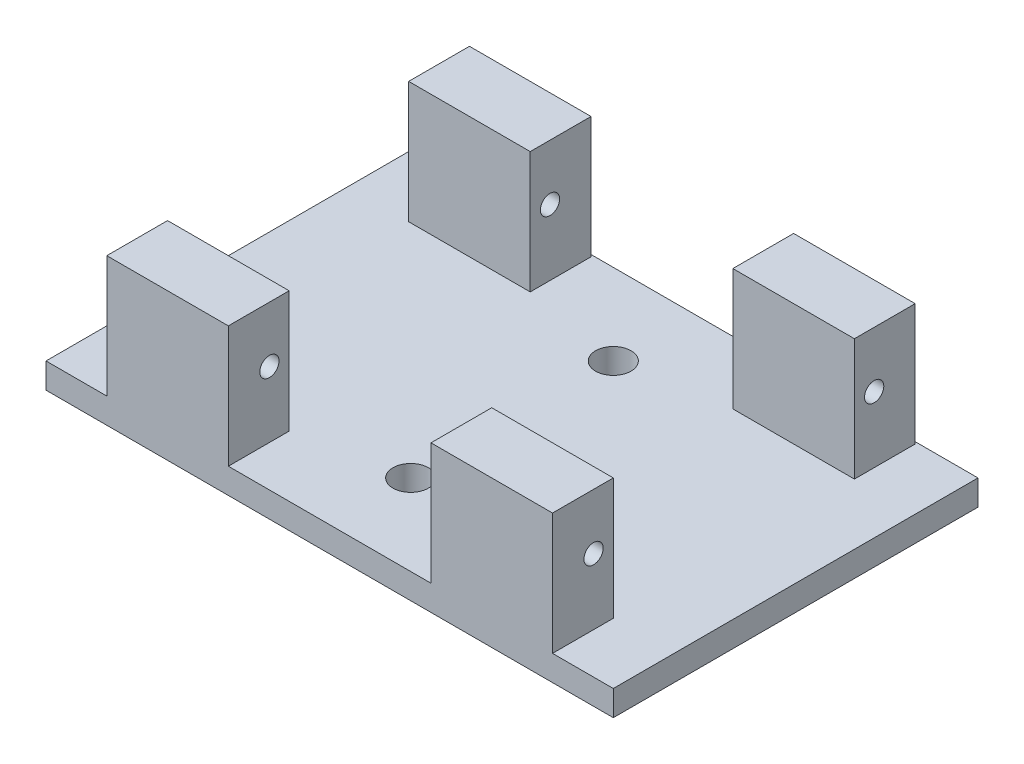
ISO-10303-21;
HEADER;
FILE_DESCRIPTION(('STEP AP214'),'2;1');
FILE_NAME('part.step','',(''),(''),'','','');
FILE_SCHEMA(('AUTOMOTIVE_DESIGN { 1 0 10303 214 1 1 1 1 }'));
ENDSEC;
DATA;
#1=APPLICATION_CONTEXT('core data for automotive mechanical design processes');
#2=APPLICATION_PROTOCOL_DEFINITION('international standard','automotive_design',2000,#1);
#3=PRODUCT_CONTEXT('',#1,'mechanical');
#4=PRODUCT('Part','Part','',(#3));
#5=PRODUCT_RELATED_PRODUCT_CATEGORY('part','',(#4));
#6=PRODUCT_DEFINITION_FORMATION('','',#4);
#7=PRODUCT_DEFINITION_CONTEXT('part definition',#1,'design');
#8=PRODUCT_DEFINITION('design','',#6,#7);
#9=PRODUCT_DEFINITION_SHAPE('','',#8);
#10=(LENGTH_UNIT() NAMED_UNIT(*) SI_UNIT(.MILLI.,.METRE.));
#11=(NAMED_UNIT(*) PLANE_ANGLE_UNIT() SI_UNIT($,.RADIAN.));
#12=(NAMED_UNIT(*) SI_UNIT($,.STERADIAN.) SOLID_ANGLE_UNIT());
#13=UNCERTAINTY_MEASURE_WITH_UNIT(LENGTH_MEASURE(1.E-05),#10,'distance_accuracy_value','');
#14=(GEOMETRIC_REPRESENTATION_CONTEXT(3) GLOBAL_UNCERTAINTY_ASSIGNED_CONTEXT((#13)) GLOBAL_UNIT_ASSIGNED_CONTEXT((#10,
#11,#12)) REPRESENTATION_CONTEXT('',''));
#15=CARTESIAN_POINT('',(0.,0.,0.));
#16=DIRECTION('',(0.,0.,1.));
#17=DIRECTION('',(1.,0.,0.));
#18=AXIS2_PLACEMENT_3D('',#15,#16,#17);
#19=CARTESIAN_POINT('',(0.,2.5,0.));
#20=DIRECTION('',(0.,1.,0.));
#21=DIRECTION('',(0.,0.,1.));
#22=AXIS2_PLACEMENT_3D('',#19,#20,#21);
#23=PLANE('',#22);
#24=CARTESIAN_POINT('',(0.,2.5,10.));
#25=DIRECTION('',(0.,1.,0.));
#26=DIRECTION('',(0.,0.,1.));
#27=AXIS2_PLACEMENT_3D('',#24,#25,#26);
#28=CIRCLE('',#27,1.75);
#29=CARTESIAN_POINT('',(0.,2.5,11.75));
#30=VERTEX_POINT('',#29);
#31=EDGE_CURVE('E691',#30,#30,#28,.T.);
#32=ORIENTED_EDGE('',*,*,#31,.F.);
#33=EDGE_LOOP('',(#32));
#34=FACE_BOUND('',#33,.T.);
#35=CARTESIAN_POINT('',(0.,2.5,-10.));
#36=DIRECTION('',(0.,1.,0.));
#37=DIRECTION('',(0.,0.,1.));
#38=AXIS2_PLACEMENT_3D('',#35,#36,#37);
#39=CIRCLE('',#38,1.75);
#40=CARTESIAN_POINT('',(0.,2.5,-8.25));
#41=VERTEX_POINT('',#40);
#42=EDGE_CURVE('E692',#41,#41,#39,.T.);
#43=ORIENTED_EDGE('',*,*,#42,.F.);
#44=EDGE_LOOP('',(#43));
#45=FACE_BOUND('',#44,.T.);
#46=DIRECTION('',(0.,0.,1.));
#47=VECTOR('',#46,1.);
#48=CARTESIAN_POINT('',(-10.,2.5,-17.8));
#49=LINE('',#48,#47);
#50=CARTESIAN_POINT('',(-10.,2.5,-17.8));
#51=VERTEX_POINT('',#50);
#52=CARTESIAN_POINT('',(-10.,2.5,-11.8));
#53=VERTEX_POINT('',#52);
#54=EDGE_CURVE('E183',#51,#53,#49,.T.);
#55=ORIENTED_EDGE('',*,*,#54,.T.);
#56=DIRECTION('',(-1.,0.,0.));
#57=VECTOR('',#56,1.);
#58=CARTESIAN_POINT('',(-10.,2.5,-11.8));
#59=LINE('',#58,#57);
#60=CARTESIAN_POINT('',(-22.,2.5,-11.8));
#61=VERTEX_POINT('',#60);
#62=EDGE_CURVE('E197',#53,#61,#59,.T.);
#63=ORIENTED_EDGE('',*,*,#62,.T.);
#64=DIRECTION('',(0.,0.,-1.));
#65=VECTOR('',#64,1.);
#66=CARTESIAN_POINT('',(-22.,2.5,-17.8));
#67=LINE('',#66,#65);
#68=CARTESIAN_POINT('',(-22.,2.5,-17.8));
#69=VERTEX_POINT('',#68);
#70=EDGE_CURVE('E61',#61,#69,#67,.T.);
#71=ORIENTED_EDGE('',*,*,#70,.T.);
#72=DIRECTION('',(1.,0.,0.));
#73=VECTOR('',#72,1.);
#74=CARTESIAN_POINT('',(-10.,2.5,-17.8));
#75=LINE('',#74,#73);
#76=EDGE_CURVE('E56',#69,#51,#75,.T.);
#77=ORIENTED_EDGE('',*,*,#76,.T.);
#78=EDGE_LOOP('',(#55,#63,#71,#77));
#79=FACE_BOUND('',#78,.T.);
#80=DIRECTION('',(0.,0.,1.));
#81=VECTOR('',#80,1.);
#82=CARTESIAN_POINT('',(-10.,2.5,12.));
#83=LINE('',#82,#81);
#84=CARTESIAN_POINT('',(-10.,2.5,12.));
#85=VERTEX_POINT('',#84);
#86=CARTESIAN_POINT('',(-10.,2.5,18.));
#87=VERTEX_POINT('',#86);
#88=EDGE_CURVE('E231',#85,#87,#83,.T.);
#89=ORIENTED_EDGE('',*,*,#88,.T.);
#90=DIRECTION('',(1.,0.,0.));
#91=VECTOR('',#90,1.);
#92=CARTESIAN_POINT('',(-28.,2.5,18.));
#93=LINE('',#92,#91);
#94=CARTESIAN_POINT('',(10.,2.5,18.));
#95=VERTEX_POINT('',#94);
#96=EDGE_CURVE('E331',#87,#95,#93,.T.);
#97=ORIENTED_EDGE('',*,*,#96,.T.);
#98=DIRECTION('',(0.,0.,1.));
#99=VECTOR('',#98,1.);
#100=CARTESIAN_POINT('',(10.,2.5,12.));
#101=LINE('',#100,#99);
#102=CARTESIAN_POINT('',(10.,2.5,12.));
#103=VERTEX_POINT('',#102);
#104=EDGE_CURVE('E275',#103,#95,#101,.T.);
#105=ORIENTED_EDGE('',*,*,#104,.F.);
#106=DIRECTION('',(-1.,0.,0.));
#107=VECTOR('',#106,1.);
#108=CARTESIAN_POINT('',(10.,2.5,12.));
#109=LINE('',#108,#107);
#110=CARTESIAN_POINT('',(22.,2.5,12.));
#111=VERTEX_POINT('',#110);
#112=EDGE_CURVE('E303',#111,#103,#109,.T.);
#113=ORIENTED_EDGE('',*,*,#112,.F.);
#114=DIRECTION('',(0.,0.,-1.));
#115=VECTOR('',#114,1.);
#116=CARTESIAN_POINT('',(22.,2.5,12.));
#117=LINE('',#116,#115);
#118=CARTESIAN_POINT('',(22.,2.5,18.));
#119=VERTEX_POINT('',#118);
#120=EDGE_CURVE('E306',#119,#111,#117,.T.);
#121=ORIENTED_EDGE('',*,*,#120,.F.);
#122=CARTESIAN_POINT('',(28.,2.5,18.));
#123=VERTEX_POINT('',#122);
#124=EDGE_CURVE('E327',#119,#123,#93,.T.);
#125=ORIENTED_EDGE('',*,*,#124,.T.);
#126=DIRECTION('',(0.,0.,-1.));
#127=VECTOR('',#126,1.);
#128=CARTESIAN_POINT('',(28.,2.5,-18.));
#129=LINE('',#128,#127);
#130=CARTESIAN_POINT('',(28.,2.5,-18.));
#131=VERTEX_POINT('',#130);
#132=EDGE_CURVE('E319',#123,#131,#129,.T.);
#133=ORIENTED_EDGE('',*,*,#132,.T.);
#134=DIRECTION('',(-1.,0.,0.));
#135=VECTOR('',#134,1.);
#136=CARTESIAN_POINT('',(-28.,2.5,-18.));
#137=LINE('',#136,#135);
#138=CARTESIAN_POINT('',(-28.,2.5,-18.));
#139=VERTEX_POINT('',#138);
#140=EDGE_CURVE('E322',#131,#139,#137,.T.);
#141=ORIENTED_EDGE('',*,*,#140,.T.);
#142=DIRECTION('',(0.,0.,1.));
#143=VECTOR('',#142,1.);
#144=CARTESIAN_POINT('',(-28.,2.5,-18.));
#145=LINE('',#144,#143);
#146=CARTESIAN_POINT('',(-28.,2.5,18.));
#147=VERTEX_POINT('',#146);
#148=EDGE_CURVE('E325',#139,#147,#145,.T.);
#149=ORIENTED_EDGE('',*,*,#148,.T.);
#150=CARTESIAN_POINT('',(-22.,2.5,18.));
#151=VERTEX_POINT('',#150);
#152=EDGE_CURVE('E328',#147,#151,#93,.T.);
#153=ORIENTED_EDGE('',*,*,#152,.T.);
#154=DIRECTION('',(0.,0.,-1.));
#155=VECTOR('',#154,1.);
#156=CARTESIAN_POINT('',(-22.,2.5,12.));
#157=LINE('',#156,#155);
#158=CARTESIAN_POINT('',(-22.,2.5,12.));
#159=VERTEX_POINT('',#158);
#160=EDGE_CURVE('E221',#151,#159,#157,.T.);
#161=ORIENTED_EDGE('',*,*,#160,.T.);
#162=DIRECTION('',(1.,0.,0.));
#163=VECTOR('',#162,1.);
#164=CARTESIAN_POINT('',(-10.,2.5,12.));
#165=LINE('',#164,#163);
#166=EDGE_CURVE('E234',#159,#85,#165,.T.);
#167=ORIENTED_EDGE('',*,*,#166,.T.);
#168=EDGE_LOOP('',(#89,#97,#105,#113,#121,#125,#133,#141,#149,#153,#161,#167));
#169=FACE_BOUND('',#168,.T.);
#170=DIRECTION('',(1.,0.,0.));
#171=VECTOR('',#170,1.);
#172=CARTESIAN_POINT('',(10.,2.5,-11.8));
#173=LINE('',#172,#171);
#174=CARTESIAN_POINT('',(10.,2.5,-11.8));
#175=VERTEX_POINT('',#174);
#176=CARTESIAN_POINT('',(22.,2.5,-11.8));
#177=VERTEX_POINT('',#176);
#178=EDGE_CURVE('E274',#175,#177,#173,.T.);
#179=ORIENTED_EDGE('',*,*,#178,.F.);
#180=DIRECTION('',(0.,0.,1.));
#181=VECTOR('',#180,1.);
#182=CARTESIAN_POINT('',(10.,2.5,-17.8));
#183=LINE('',#182,#181);
#184=CARTESIAN_POINT('',(10.,2.5,-17.8));
#185=VERTEX_POINT('',#184);
#186=EDGE_CURVE('E271',#185,#175,#183,.T.);
#187=ORIENTED_EDGE('',*,*,#186,.F.);
#188=DIRECTION('',(-1.,0.,0.));
#189=VECTOR('',#188,1.);
#190=CARTESIAN_POINT('',(10.,2.5,-17.8));
#191=LINE('',#190,#189);
#192=CARTESIAN_POINT('',(22.,2.5,-17.8));
#193=VERTEX_POINT('',#192);
#194=EDGE_CURVE('E264',#193,#185,#191,.T.);
#195=ORIENTED_EDGE('',*,*,#194,.F.);
#196=DIRECTION('',(0.,0.,-1.));
#197=VECTOR('',#196,1.);
#198=CARTESIAN_POINT('',(22.,2.5,-17.8));
#199=LINE('',#198,#197);
#200=EDGE_CURVE('E277',#177,#193,#199,.T.);
#201=ORIENTED_EDGE('',*,*,#200,.F.);
#202=EDGE_LOOP('',(#179,#187,#195,#201));
#203=FACE_BOUND('',#202,.T.);
#204=ADVANCED_FACE('F41',(#34,#45,#79,#169,#203),#23,.T.);
#205=CARTESIAN_POINT('',(28.,2.5,-18.));
#206=DIRECTION('',(-1.,0.,0.));
#207=DIRECTION('',(0.,0.,1.));
#208=AXIS2_PLACEMENT_3D('',#205,#206,#207);
#209=PLANE('',#208);
#210=DIRECTION('',(0.,0.,-1.));
#211=VECTOR('',#210,1.);
#212=CARTESIAN_POINT('',(28.,0.,-18.));
#213=LINE('',#212,#211);
#214=CARTESIAN_POINT('',(28.,0.,18.));
#215=VERTEX_POINT('',#214);
#216=CARTESIAN_POINT('',(28.,0.,-18.));
#217=VERTEX_POINT('',#216);
#218=EDGE_CURVE('E290',#215,#217,#213,.T.);
#219=ORIENTED_EDGE('',*,*,#218,.T.);
#220=DIRECTION('',(0.,-1.,0.));
#221=VECTOR('',#220,1.);
#222=CARTESIAN_POINT('',(28.,2.5,-18.));
#223=LINE('',#222,#221);
#224=EDGE_CURVE('E11',#131,#217,#223,.T.);
#225=ORIENTED_EDGE('',*,*,#224,.F.);
#226=ORIENTED_EDGE('',*,*,#132,.F.);
#227=DIRECTION('',(0.,-1.,0.));
#228=VECTOR('',#227,1.);
#229=CARTESIAN_POINT('',(28.,2.5,18.));
#230=LINE('',#229,#228);
#231=EDGE_CURVE('E330',#123,#215,#230,.T.);
#232=ORIENTED_EDGE('',*,*,#231,.T.);
#233=EDGE_LOOP('',(#219,#225,#226,#232));
#234=FACE_BOUND('',#233,.T.);
#235=ADVANCED_FACE('F43',(#234),#209,.F.);
#236=CARTESIAN_POINT('',(-28.,2.5,-18.));
#237=DIRECTION('',(0.,0.,1.));
#238=DIRECTION('',(1.,0.,0.));
#239=AXIS2_PLACEMENT_3D('',#236,#237,#238);
#240=PLANE('',#239);
#241=DIRECTION('',(-1.,0.,0.));
#242=VECTOR('',#241,1.);
#243=CARTESIAN_POINT('',(-28.,0.,-18.));
#244=LINE('',#243,#242);
#245=CARTESIAN_POINT('',(-28.,0.,-18.));
#246=VERTEX_POINT('',#245);
#247=EDGE_CURVE('E334',#217,#246,#244,.T.);
#248=ORIENTED_EDGE('',*,*,#247,.T.);
#249=DIRECTION('',(0.,-1.,0.));
#250=VECTOR('',#249,1.);
#251=CARTESIAN_POINT('',(-28.,2.5,-18.));
#252=LINE('',#251,#250);
#253=EDGE_CURVE('E49',#139,#246,#252,.T.);
#254=ORIENTED_EDGE('',*,*,#253,.F.);
#255=ORIENTED_EDGE('',*,*,#140,.F.);
#256=ORIENTED_EDGE('',*,*,#224,.T.);
#257=EDGE_LOOP('',(#248,#254,#255,#256));
#258=FACE_BOUND('',#257,.T.);
#259=ADVANCED_FACE('F401',(#258),#240,.F.);
#260=CARTESIAN_POINT('',(-28.,2.5,-18.));
#261=DIRECTION('',(1.,0.,0.));
#262=DIRECTION('',(0.,0.,-1.));
#263=AXIS2_PLACEMENT_3D('',#260,#261,#262);
#264=PLANE('',#263);
#265=DIRECTION('',(0.,0.,1.));
#266=VECTOR('',#265,1.);
#267=CARTESIAN_POINT('',(-28.,0.,-18.));
#268=LINE('',#267,#266);
#269=CARTESIAN_POINT('',(-28.,0.,18.));
#270=VERTEX_POINT('',#269);
#271=EDGE_CURVE('E336',#246,#270,#268,.T.);
#272=ORIENTED_EDGE('',*,*,#271,.T.);
#273=DIRECTION('',(0.,-1.,0.));
#274=VECTOR('',#273,1.);
#275=CARTESIAN_POINT('',(-28.,2.5,18.));
#276=LINE('',#275,#274);
#277=EDGE_CURVE('E341',#147,#270,#276,.T.);
#278=ORIENTED_EDGE('',*,*,#277,.F.);
#279=ORIENTED_EDGE('',*,*,#148,.F.);
#280=ORIENTED_EDGE('',*,*,#253,.T.);
#281=EDGE_LOOP('',(#272,#278,#279,#280));
#282=FACE_BOUND('',#281,.T.);
#283=ADVANCED_FACE('F348',(#282),#264,.F.);
#284=CARTESIAN_POINT('',(-28.,2.5,18.));
#285=DIRECTION('',(0.,0.,-1.));
#286=DIRECTION('',(-1.,0.,0.));
#287=AXIS2_PLACEMENT_3D('',#284,#285,#286);
#288=PLANE('',#287);
#289=DIRECTION('',(1.,0.,0.));
#290=VECTOR('',#289,1.);
#291=CARTESIAN_POINT('',(-28.,0.,18.));
#292=LINE('',#291,#290);
#293=EDGE_CURVE('E323',#270,#215,#292,.T.);
#294=ORIENTED_EDGE('',*,*,#293,.T.);
#295=ORIENTED_EDGE('',*,*,#231,.F.);
#296=ORIENTED_EDGE('',*,*,#124,.F.);
#297=DIRECTION('',(0.,-1.,0.));
#298=VECTOR('',#297,1.);
#299=CARTESIAN_POINT('',(22.,14.5,18.));
#300=LINE('',#299,#298);
#301=CARTESIAN_POINT('',(22.,14.5,18.));
#302=VERTEX_POINT('',#301);
#303=EDGE_CURVE('E293',#302,#119,#300,.T.);
#304=ORIENTED_EDGE('',*,*,#303,.F.);
#305=DIRECTION('',(1.,0.,0.));
#306=VECTOR('',#305,1.);
#307=CARTESIAN_POINT('',(10.,14.5,18.));
#308=LINE('',#307,#306);
#309=CARTESIAN_POINT('',(10.,14.5,18.));
#310=VERTEX_POINT('',#309);
#311=EDGE_CURVE('E315',#310,#302,#308,.T.);
#312=ORIENTED_EDGE('',*,*,#311,.F.);
#313=DIRECTION('',(0.,-1.,0.));
#314=VECTOR('',#313,1.);
#315=CARTESIAN_POINT('',(10.,14.5,18.));
#316=LINE('',#315,#314);
#317=EDGE_CURVE('E259',#310,#95,#316,.T.);
#318=ORIENTED_EDGE('',*,*,#317,.T.);
#319=ORIENTED_EDGE('',*,*,#96,.F.);
#320=DIRECTION('',(0.,-1.,0.));
#321=VECTOR('',#320,1.);
#322=CARTESIAN_POINT('',(-10.,14.5,18.));
#323=LINE('',#322,#321);
#324=CARTESIAN_POINT('',(-10.,14.5,18.));
#325=VERTEX_POINT('',#324);
#326=EDGE_CURVE('E230',#325,#87,#323,.T.);
#327=ORIENTED_EDGE('',*,*,#326,.F.);
#328=DIRECTION('',(-1.,0.,0.));
#329=VECTOR('',#328,1.);
#330=CARTESIAN_POINT('',(-10.,14.5,18.));
#331=LINE('',#330,#329);
#332=CARTESIAN_POINT('',(-22.,14.5,18.));
#333=VERTEX_POINT('',#332);
#334=EDGE_CURVE('E227',#325,#333,#331,.T.);
#335=ORIENTED_EDGE('',*,*,#334,.T.);
#336=DIRECTION('',(0.,-1.,0.));
#337=VECTOR('',#336,1.);
#338=CARTESIAN_POINT('',(-22.,14.5,18.));
#339=LINE('',#338,#337);
#340=EDGE_CURVE('E240',#333,#151,#339,.T.);
#341=ORIENTED_EDGE('',*,*,#340,.T.);
#342=ORIENTED_EDGE('',*,*,#152,.F.);
#343=ORIENTED_EDGE('',*,*,#277,.T.);
#344=EDGE_LOOP('',(#294,#295,#296,#304,#312,#318,#319,#327,#335,#341,#342,#343));
#345=FACE_BOUND('',#344,.T.);
#346=ADVANCED_FACE('F357',(#345),#288,.F.);
#347=CARTESIAN_POINT('',(0.,0.,0.));
#348=DIRECTION('',(0.,1.,0.));
#349=DIRECTION('',(0.,0.,1.));
#350=AXIS2_PLACEMENT_3D('',#347,#348,#349);
#351=PLANE('',#350);
#352=CARTESIAN_POINT('',(0.,0.,10.));
#353=DIRECTION('',(0.,1.,0.));
#354=DIRECTION('',(0.,0.,1.));
#355=AXIS2_PLACEMENT_3D('',#352,#353,#354);
#356=CIRCLE('',#355,1.75);
#357=CARTESIAN_POINT('',(0.,0.,11.75));
#358=VERTEX_POINT('',#357);
#359=EDGE_CURVE('E689',#358,#358,#356,.T.);
#360=ORIENTED_EDGE('',*,*,#359,.T.);
#361=EDGE_LOOP('',(#360));
#362=FACE_BOUND('',#361,.T.);
#363=CARTESIAN_POINT('',(0.,0.,-10.));
#364=DIRECTION('',(0.,1.,0.));
#365=DIRECTION('',(0.,0.,1.));
#366=AXIS2_PLACEMENT_3D('',#363,#364,#365);
#367=CIRCLE('',#366,1.75);
#368=CARTESIAN_POINT('',(0.,0.,-8.25));
#369=VERTEX_POINT('',#368);
#370=EDGE_CURVE('E697',#369,#369,#367,.T.);
#371=ORIENTED_EDGE('',*,*,#370,.T.);
#372=EDGE_LOOP('',(#371));
#373=FACE_BOUND('',#372,.T.);
#374=ORIENTED_EDGE('',*,*,#218,.F.);
#375=ORIENTED_EDGE('',*,*,#293,.F.);
#376=ORIENTED_EDGE('',*,*,#271,.F.);
#377=ORIENTED_EDGE('',*,*,#247,.F.);
#378=EDGE_LOOP('',(#374,#375,#376,#377));
#379=FACE_BOUND('',#378,.T.);
#380=ADVANCED_FACE('F354',(#362,#373,#379),#351,.F.);
#381=CARTESIAN_POINT('',(10.,14.5,-17.8));
#382=DIRECTION('',(1.,0.,0.));
#383=DIRECTION('',(0.,0.,-1.));
#384=AXIS2_PLACEMENT_3D('',#381,#382,#383);
#385=PLANE('',#384);
#386=CARTESIAN_POINT('',(10.,9.,-13.75));
#387=DIRECTION('',(1.,0.,0.));
#388=DIRECTION('',(0.,0.,-1.));
#389=AXIS2_PLACEMENT_3D('',#386,#387,#388);
#390=CIRCLE('',#389,0.949999999999999);
#391=CARTESIAN_POINT('',(10.,9.,-14.7));
#392=VERTEX_POINT('',#391);
#393=EDGE_CURVE('E256',#392,#392,#390,.T.);
#394=ORIENTED_EDGE('',*,*,#393,.T.);
#395=EDGE_LOOP('',(#394));
#396=FACE_BOUND('',#395,.T.);
#397=ORIENTED_EDGE('',*,*,#186,.T.);
#398=DIRECTION('',(0.,-1.,0.));
#399=VECTOR('',#398,1.);
#400=CARTESIAN_POINT('',(10.,14.5,-11.8));
#401=LINE('',#400,#399);
#402=CARTESIAN_POINT('',(10.,14.5,-11.8));
#403=VERTEX_POINT('',#402);
#404=EDGE_CURVE('E288',#403,#175,#401,.T.);
#405=ORIENTED_EDGE('',*,*,#404,.F.);
#406=DIRECTION('',(0.,0.,1.));
#407=VECTOR('',#406,1.);
#408=CARTESIAN_POINT('',(10.,14.5,-17.8));
#409=LINE('',#408,#407);
#410=CARTESIAN_POINT('',(10.,14.5,-17.8));
#411=VERTEX_POINT('',#410);
#412=EDGE_CURVE('E260',#411,#403,#409,.T.);
#413=ORIENTED_EDGE('',*,*,#412,.F.);
#414=DIRECTION('',(0.,-1.,0.));
#415=VECTOR('',#414,1.);
#416=CARTESIAN_POINT('',(10.,14.5,-17.8));
#417=LINE('',#416,#415);
#418=EDGE_CURVE('E270',#411,#185,#417,.T.);
#419=ORIENTED_EDGE('',*,*,#418,.T.);
#420=EDGE_LOOP('',(#397,#405,#413,#419));
#421=FACE_BOUND('',#420,.T.);
#422=ADVANCED_FACE('F406',(#396,#421),#385,.F.);
#423=CARTESIAN_POINT('',(10.,14.5,-11.8));
#424=DIRECTION('',(0.,0.,-1.));
#425=DIRECTION('',(-1.,0.,0.));
#426=AXIS2_PLACEMENT_3D('',#423,#424,#425);
#427=PLANE('',#426);
#428=ORIENTED_EDGE('',*,*,#178,.T.);
#429=DIRECTION('',(0.,-1.,0.));
#430=VECTOR('',#429,1.);
#431=CARTESIAN_POINT('',(22.,14.5,-11.8));
#432=LINE('',#431,#430);
#433=CARTESIAN_POINT('',(22.,14.5,-11.8));
#434=VERTEX_POINT('',#433);
#435=EDGE_CURVE('E285',#434,#177,#432,.T.);
#436=ORIENTED_EDGE('',*,*,#435,.F.);
#437=DIRECTION('',(1.,0.,0.));
#438=VECTOR('',#437,1.);
#439=CARTESIAN_POINT('',(10.,14.5,-11.8));
#440=LINE('',#439,#438);
#441=EDGE_CURVE('E263',#403,#434,#440,.T.);
#442=ORIENTED_EDGE('',*,*,#441,.F.);
#443=ORIENTED_EDGE('',*,*,#404,.T.);
#444=EDGE_LOOP('',(#428,#436,#442,#443));
#445=FACE_BOUND('',#444,.T.);
#446=ADVANCED_FACE('F426',(#445),#427,.F.);
#447=CARTESIAN_POINT('',(22.,14.5,-17.8));
#448=DIRECTION('',(-1.,0.,0.));
#449=DIRECTION('',(0.,0.,1.));
#450=AXIS2_PLACEMENT_3D('',#447,#448,#449);
#451=PLANE('',#450);
#452=CARTESIAN_POINT('',(22.,9.,-13.75));
#453=DIRECTION('',(1.,0.,0.));
#454=DIRECTION('',(0.,0.,-1.));
#455=AXIS2_PLACEMENT_3D('',#452,#453,#454);
#456=CIRCLE('',#455,0.949999999999999);
#457=CARTESIAN_POINT('',(22.,9.,-14.7));
#458=VERTEX_POINT('',#457);
#459=EDGE_CURVE('E186',#458,#458,#456,.T.);
#460=ORIENTED_EDGE('',*,*,#459,.F.);
#461=EDGE_LOOP('',(#460));
#462=FACE_BOUND('',#461,.T.);
#463=ORIENTED_EDGE('',*,*,#200,.T.);
#464=DIRECTION('',(0.,-1.,0.));
#465=VECTOR('',#464,1.);
#466=CARTESIAN_POINT('',(22.,14.5,-17.8));
#467=LINE('',#466,#465);
#468=CARTESIAN_POINT('',(22.,14.5,-17.8));
#469=VERTEX_POINT('',#468);
#470=EDGE_CURVE('E283',#469,#193,#467,.T.);
#471=ORIENTED_EDGE('',*,*,#470,.F.);
#472=DIRECTION('',(0.,0.,-1.));
#473=VECTOR('',#472,1.);
#474=CARTESIAN_POINT('',(22.,14.5,-17.8));
#475=LINE('',#474,#473);
#476=EDGE_CURVE('E266',#434,#469,#475,.T.);
#477=ORIENTED_EDGE('',*,*,#476,.F.);
#478=ORIENTED_EDGE('',*,*,#435,.T.);
#479=EDGE_LOOP('',(#463,#471,#477,#478));
#480=FACE_BOUND('',#479,.T.);
#481=ADVANCED_FACE('F430',(#462,#480),#451,.F.);
#482=CARTESIAN_POINT('',(10.,14.5,-17.8));
#483=DIRECTION('',(0.,0.,1.));
#484=DIRECTION('',(1.,0.,0.));
#485=AXIS2_PLACEMENT_3D('',#482,#483,#484);
#486=PLANE('',#485);
#487=ORIENTED_EDGE('',*,*,#194,.T.);
#488=ORIENTED_EDGE('',*,*,#418,.F.);
#489=DIRECTION('',(-1.,0.,0.));
#490=VECTOR('',#489,1.);
#491=CARTESIAN_POINT('',(10.,14.5,-17.8));
#492=LINE('',#491,#490);
#493=EDGE_CURVE('E268',#469,#411,#492,.T.);
#494=ORIENTED_EDGE('',*,*,#493,.F.);
#495=ORIENTED_EDGE('',*,*,#470,.T.);
#496=EDGE_LOOP('',(#487,#488,#494,#495));
#497=FACE_BOUND('',#496,.T.);
#498=ADVANCED_FACE('F438',(#497),#486,.F.);
#499=CARTESIAN_POINT('',(0.,14.5,0.));
#500=DIRECTION('',(0.,1.,0.));
#501=DIRECTION('',(0.,0.,1.));
#502=AXIS2_PLACEMENT_3D('',#499,#500,#501);
#503=PLANE('',#502);
#504=ORIENTED_EDGE('',*,*,#412,.T.);
#505=ORIENTED_EDGE('',*,*,#441,.T.);
#506=ORIENTED_EDGE('',*,*,#476,.T.);
#507=ORIENTED_EDGE('',*,*,#493,.T.);
#508=EDGE_LOOP('',(#504,#505,#506,#507));
#509=FACE_BOUND('',#508,.T.);
#510=ADVANCED_FACE('F442',(#509),#503,.T.);
#511=CARTESIAN_POINT('',(10.,14.5,12.));
#512=DIRECTION('',(1.,0.,0.));
#513=DIRECTION('',(0.,0.,-1.));
#514=AXIS2_PLACEMENT_3D('',#511,#512,#513);
#515=PLANE('',#514);
#516=CARTESIAN_POINT('',(10.,9.,13.95));
#517=DIRECTION('',(1.,0.,0.));
#518=DIRECTION('',(0.,0.,-1.));
#519=AXIS2_PLACEMENT_3D('',#516,#517,#518);
#520=CIRCLE('',#519,0.949999999999999);
#521=CARTESIAN_POINT('',(10.,9.,13.));
#522=VERTEX_POINT('',#521);
#523=EDGE_CURVE('E251',#522,#522,#520,.T.);
#524=ORIENTED_EDGE('',*,*,#523,.T.);
#525=EDGE_LOOP('',(#524));
#526=FACE_BOUND('',#525,.T.);
#527=ORIENTED_EDGE('',*,*,#104,.T.);
#528=ORIENTED_EDGE('',*,*,#317,.F.);
#529=DIRECTION('',(0.,0.,1.));
#530=VECTOR('',#529,1.);
#531=CARTESIAN_POINT('',(10.,14.5,12.));
#532=LINE('',#531,#530);
#533=CARTESIAN_POINT('',(10.,14.5,12.));
#534=VERTEX_POINT('',#533);
#535=EDGE_CURVE('E307',#534,#310,#532,.T.);
#536=ORIENTED_EDGE('',*,*,#535,.F.);
#537=DIRECTION('',(0.,-1.,0.));
#538=VECTOR('',#537,1.);
#539=CARTESIAN_POINT('',(10.,14.5,12.));
#540=LINE('',#539,#538);
#541=EDGE_CURVE('E299',#534,#103,#540,.T.);
#542=ORIENTED_EDGE('',*,*,#541,.T.);
#543=EDGE_LOOP('',(#527,#528,#536,#542));
#544=FACE_BOUND('',#543,.T.);
#545=ADVANCED_FACE('F370',(#526,#544),#515,.F.);
#546=CARTESIAN_POINT('',(22.,14.5,12.));
#547=DIRECTION('',(-1.,0.,0.));
#548=DIRECTION('',(0.,0.,1.));
#549=AXIS2_PLACEMENT_3D('',#546,#547,#548);
#550=PLANE('',#549);
#551=CARTESIAN_POINT('',(22.,9.,13.95));
#552=DIRECTION('',(1.,0.,0.));
#553=DIRECTION('',(0.,0.,-1.));
#554=AXIS2_PLACEMENT_3D('',#551,#552,#553);
#555=CIRCLE('',#554,0.949999999999999);
#556=CARTESIAN_POINT('',(22.,9.,13.));
#557=VERTEX_POINT('',#556);
#558=EDGE_CURVE('E248',#557,#557,#555,.T.);
#559=ORIENTED_EDGE('',*,*,#558,.F.);
#560=EDGE_LOOP('',(#559));
#561=FACE_BOUND('',#560,.T.);
#562=ORIENTED_EDGE('',*,*,#120,.T.);
#563=DIRECTION('',(0.,-1.,0.));
#564=VECTOR('',#563,1.);
#565=CARTESIAN_POINT('',(22.,14.5,12.));
#566=LINE('',#565,#564);
#567=CARTESIAN_POINT('',(22.,14.5,12.));
#568=VERTEX_POINT('',#567);
#569=EDGE_CURVE('E296',#568,#111,#566,.T.);
#570=ORIENTED_EDGE('',*,*,#569,.F.);
#571=DIRECTION('',(0.,0.,-1.));
#572=VECTOR('',#571,1.);
#573=CARTESIAN_POINT('',(22.,14.5,12.));
#574=LINE('',#573,#572);
#575=EDGE_CURVE('E313',#302,#568,#574,.T.);
#576=ORIENTED_EDGE('',*,*,#575,.F.);
#577=ORIENTED_EDGE('',*,*,#303,.T.);
#578=EDGE_LOOP('',(#562,#570,#576,#577));
#579=FACE_BOUND('',#578,.T.);
#580=ADVANCED_FACE('F377',(#561,#579),#550,.F.);
#581=CARTESIAN_POINT('',(10.,14.5,12.));
#582=DIRECTION('',(0.,0.,1.));
#583=DIRECTION('',(1.,0.,0.));
#584=AXIS2_PLACEMENT_3D('',#581,#582,#583);
#585=PLANE('',#584);
#586=ORIENTED_EDGE('',*,*,#112,.T.);
#587=ORIENTED_EDGE('',*,*,#541,.F.);
#588=DIRECTION('',(-1.,0.,0.));
#589=VECTOR('',#588,1.);
#590=CARTESIAN_POINT('',(10.,14.5,12.));
#591=LINE('',#590,#589);
#592=EDGE_CURVE('E302',#568,#534,#591,.T.);
#593=ORIENTED_EDGE('',*,*,#592,.F.);
#594=ORIENTED_EDGE('',*,*,#569,.T.);
#595=EDGE_LOOP('',(#586,#587,#593,#594));
#596=FACE_BOUND('',#595,.T.);
#597=ADVANCED_FACE('F374',(#596),#585,.F.);
#598=CARTESIAN_POINT('',(0.,14.5,0.));
#599=DIRECTION('',(0.,1.,0.));
#600=DIRECTION('',(0.,0.,1.));
#601=AXIS2_PLACEMENT_3D('',#598,#599,#600);
#602=PLANE('',#601);
#603=ORIENTED_EDGE('',*,*,#535,.T.);
#604=ORIENTED_EDGE('',*,*,#311,.T.);
#605=ORIENTED_EDGE('',*,*,#575,.T.);
#606=ORIENTED_EDGE('',*,*,#592,.T.);
#607=EDGE_LOOP('',(#603,#604,#605,#606));
#608=FACE_BOUND('',#607,.T.);
#609=ADVANCED_FACE('F380',(#608),#602,.T.);
#610=CARTESIAN_POINT('',(-28.,9.,13.95));
#611=DIRECTION('',(1.,0.,0.));
#612=DIRECTION('',(0.,0.,-1.));
#613=AXIS2_PLACEMENT_3D('',#610,#611,#612);
#614=CYLINDRICAL_SURFACE('',#613,0.949999999999999);
#615=ORIENTED_EDGE('',*,*,#558,.T.);
#616=EDGE_LOOP('',(#615));
#617=FACE_BOUND('',#616,.T.);
#618=ORIENTED_EDGE('',*,*,#523,.F.);
#619=EDGE_LOOP('',(#618));
#620=FACE_BOUND('',#619,.T.);
#621=ADVANCED_FACE('F382',(#617,#620),#614,.F.);
#622=CARTESIAN_POINT('',(-28.,9.,-13.75));
#623=DIRECTION('',(1.,0.,0.));
#624=DIRECTION('',(0.,0.,-1.));
#625=AXIS2_PLACEMENT_3D('',#622,#623,#624);
#626=CYLINDRICAL_SURFACE('',#625,0.949999999999999);
#627=ORIENTED_EDGE('',*,*,#459,.T.);
#628=EDGE_LOOP('',(#627));
#629=FACE_BOUND('',#628,.T.);
#630=ORIENTED_EDGE('',*,*,#393,.F.);
#631=EDGE_LOOP('',(#630));
#632=FACE_BOUND('',#631,.T.);
#633=ADVANCED_FACE('F389',(#629,#632),#626,.F.);
#634=CARTESIAN_POINT('',(-10.,14.5,12.));
#635=DIRECTION('',(1.,0.,0.));
#636=DIRECTION('',(0.,0.,-1.));
#637=AXIS2_PLACEMENT_3D('',#634,#635,#636);
#638=PLANE('',#637);
#639=CARTESIAN_POINT('',(-10.,9.,13.95));
#640=DIRECTION('',(1.,0.,0.));
#641=DIRECTION('',(0.,0.,-1.));
#642=AXIS2_PLACEMENT_3D('',#639,#640,#641);
#643=CIRCLE('',#642,0.949999999999999);
#644=CARTESIAN_POINT('',(-10.,9.,14.9));
#645=VERTEX_POINT('',#644);
#646=EDGE_CURVE('E235',#645,#645,#643,.F.);
#647=ORIENTED_EDGE('',*,*,#646,.T.);
#648=EDGE_LOOP('',(#647));
#649=FACE_BOUND('',#648,.T.);
#650=ORIENTED_EDGE('',*,*,#88,.F.);
#651=DIRECTION('',(0.,-1.,0.));
#652=VECTOR('',#651,1.);
#653=CARTESIAN_POINT('',(-10.,14.5,12.));
#654=LINE('',#653,#652);
#655=CARTESIAN_POINT('',(-10.,14.5,12.));
#656=VERTEX_POINT('',#655);
#657=EDGE_CURVE('E208',#656,#85,#654,.T.);
#658=ORIENTED_EDGE('',*,*,#657,.F.);
#659=DIRECTION('',(0.,0.,1.));
#660=VECTOR('',#659,1.);
#661=CARTESIAN_POINT('',(-10.,14.5,12.));
#662=LINE('',#661,#660);
#663=EDGE_CURVE('E217',#656,#325,#662,.T.);
#664=ORIENTED_EDGE('',*,*,#663,.T.);
#665=ORIENTED_EDGE('',*,*,#326,.T.);
#666=EDGE_LOOP('',(#650,#658,#664,#665));
#667=FACE_BOUND('',#666,.T.);
#668=ADVANCED_FACE('F483',(#649,#667),#638,.T.);
#669=CARTESIAN_POINT('',(-10.,14.5,12.));
#670=DIRECTION('',(0.,0.,-1.));
#671=DIRECTION('',(-1.,0.,0.));
#672=AXIS2_PLACEMENT_3D('',#669,#670,#671);
#673=PLANE('',#672);
#674=ORIENTED_EDGE('',*,*,#166,.F.);
#675=DIRECTION('',(0.,-1.,0.));
#676=VECTOR('',#675,1.);
#677=CARTESIAN_POINT('',(-22.,14.5,12.));
#678=LINE('',#677,#676);
#679=CARTESIAN_POINT('',(-22.,14.5,12.));
#680=VERTEX_POINT('',#679);
#681=EDGE_CURVE('E243',#680,#159,#678,.T.);
#682=ORIENTED_EDGE('',*,*,#681,.F.);
#683=DIRECTION('',(1.,0.,0.));
#684=VECTOR('',#683,1.);
#685=CARTESIAN_POINT('',(-10.,14.5,12.));
#686=LINE('',#685,#684);
#687=EDGE_CURVE('E220',#680,#656,#686,.T.);
#688=ORIENTED_EDGE('',*,*,#687,.T.);
#689=ORIENTED_EDGE('',*,*,#657,.T.);
#690=EDGE_LOOP('',(#674,#682,#688,#689));
#691=FACE_BOUND('',#690,.T.);
#692=ADVANCED_FACE('F501',(#691),#673,.T.);
#693=CARTESIAN_POINT('',(-22.,14.5,12.));
#694=DIRECTION('',(-1.,0.,0.));
#695=DIRECTION('',(0.,0.,1.));
#696=AXIS2_PLACEMENT_3D('',#693,#694,#695);
#697=PLANE('',#696);
#698=CARTESIAN_POINT('',(-22.,9.,13.95));
#699=DIRECTION('',(1.,0.,0.));
#700=DIRECTION('',(0.,0.,-1.));
#701=AXIS2_PLACEMENT_3D('',#698,#699,#700);
#702=CIRCLE('',#701,0.949999999999999);
#703=CARTESIAN_POINT('',(-22.,9.,14.9));
#704=VERTEX_POINT('',#703);
#705=EDGE_CURVE('E702',#704,#704,#702,.T.);
#706=ORIENTED_EDGE('',*,*,#705,.T.);
#707=EDGE_LOOP('',(#706));
#708=FACE_BOUND('',#707,.T.);
#709=ORIENTED_EDGE('',*,*,#160,.F.);
#710=ORIENTED_EDGE('',*,*,#340,.F.);
#711=DIRECTION('',(0.,0.,-1.));
#712=VECTOR('',#711,1.);
#713=CARTESIAN_POINT('',(-22.,14.5,12.));
#714=LINE('',#713,#712);
#715=EDGE_CURVE('E224',#333,#680,#714,.T.);
#716=ORIENTED_EDGE('',*,*,#715,.T.);
#717=ORIENTED_EDGE('',*,*,#681,.T.);
#718=EDGE_LOOP('',(#709,#710,#716,#717));
#719=FACE_BOUND('',#718,.T.);
#720=ADVANCED_FACE('F511',(#708,#719),#697,.T.);
#721=CARTESIAN_POINT('',(0.,14.5,0.));
#722=DIRECTION('',(0.,1.,0.));
#723=DIRECTION('',(0.,0.,1.));
#724=AXIS2_PLACEMENT_3D('',#721,#722,#723);
#725=PLANE('',#724);
#726=ORIENTED_EDGE('',*,*,#663,.F.);
#727=ORIENTED_EDGE('',*,*,#687,.F.);
#728=ORIENTED_EDGE('',*,*,#715,.F.);
#729=ORIENTED_EDGE('',*,*,#334,.F.);
#730=EDGE_LOOP('',(#726,#727,#728,#729));
#731=FACE_BOUND('',#730,.T.);
#732=ADVANCED_FACE('F521',(#731),#725,.T.);
#733=CARTESIAN_POINT('',(-10.,14.5,-17.8));
#734=DIRECTION('',(1.,0.,0.));
#735=DIRECTION('',(0.,0.,-1.));
#736=AXIS2_PLACEMENT_3D('',#733,#734,#735);
#737=PLANE('',#736);
#738=CARTESIAN_POINT('',(-9.99999999999999,9.,-13.75));
#739=DIRECTION('',(1.,0.,0.));
#740=DIRECTION('',(0.,0.,-1.));
#741=AXIS2_PLACEMENT_3D('',#738,#739,#740);
#742=CIRCLE('',#741,0.949999999999999);
#743=CARTESIAN_POINT('',(-10.,9.,-12.8));
#744=VERTEX_POINT('',#743);
#745=EDGE_CURVE('E705',#744,#744,#742,.F.);
#746=ORIENTED_EDGE('',*,*,#745,.T.);
#747=EDGE_LOOP('',(#746));
#748=FACE_BOUND('',#747,.T.);
#749=ORIENTED_EDGE('',*,*,#54,.F.);
#750=DIRECTION('',(0.,-1.,0.));
#751=VECTOR('',#750,1.);
#752=CARTESIAN_POINT('',(-10.,14.5,-17.8));
#753=LINE('',#752,#751);
#754=CARTESIAN_POINT('',(-10.,14.5,-17.8));
#755=VERTEX_POINT('',#754);
#756=EDGE_CURVE('E177',#755,#51,#753,.T.);
#757=ORIENTED_EDGE('',*,*,#756,.F.);
#758=DIRECTION('',(0.,0.,1.));
#759=VECTOR('',#758,1.);
#760=CARTESIAN_POINT('',(-10.,14.5,-17.8));
#761=LINE('',#760,#759);
#762=CARTESIAN_POINT('',(-10.,14.5,-11.8));
#763=VERTEX_POINT('',#762);
#764=EDGE_CURVE('E181',#755,#763,#761,.T.);
#765=ORIENTED_EDGE('',*,*,#764,.T.);
#766=DIRECTION('',(0.,-1.,0.));
#767=VECTOR('',#766,1.);
#768=CARTESIAN_POINT('',(-10.,14.5,-11.8));
#769=LINE('',#768,#767);
#770=EDGE_CURVE('E206',#763,#53,#769,.T.);
#771=ORIENTED_EDGE('',*,*,#770,.T.);
#772=EDGE_LOOP('',(#749,#757,#765,#771));
#773=FACE_BOUND('',#772,.T.);
#774=ADVANCED_FACE('F179',(#748,#773),#737,.T.);
#775=CARTESIAN_POINT('',(-10.,14.5,-17.8));
#776=DIRECTION('',(0.,0.,-1.));
#777=DIRECTION('',(-1.,0.,0.));
#778=AXIS2_PLACEMENT_3D('',#775,#776,#777);
#779=PLANE('',#778);
#780=ORIENTED_EDGE('',*,*,#76,.F.);
#781=DIRECTION('',(0.,-1.,0.));
#782=VECTOR('',#781,1.);
#783=CARTESIAN_POINT('',(-22.,14.5,-17.8));
#784=LINE('',#783,#782);
#785=CARTESIAN_POINT('',(-22.,14.5,-17.8));
#786=VERTEX_POINT('',#785);
#787=EDGE_CURVE('E187',#786,#69,#784,.T.);
#788=ORIENTED_EDGE('',*,*,#787,.F.);
#789=DIRECTION('',(1.,0.,0.));
#790=VECTOR('',#789,1.);
#791=CARTESIAN_POINT('',(-10.,14.5,-17.8));
#792=LINE('',#791,#790);
#793=EDGE_CURVE('E193',#786,#755,#792,.T.);
#794=ORIENTED_EDGE('',*,*,#793,.T.);
#795=ORIENTED_EDGE('',*,*,#756,.T.);
#796=EDGE_LOOP('',(#780,#788,#794,#795));
#797=FACE_BOUND('',#796,.T.);
#798=ADVANCED_FACE('F199',(#797),#779,.T.);
#799=CARTESIAN_POINT('',(-22.,14.5,-17.8));
#800=DIRECTION('',(-1.,0.,0.));
#801=DIRECTION('',(0.,0.,1.));
#802=AXIS2_PLACEMENT_3D('',#799,#800,#801);
#803=PLANE('',#802);
#804=CARTESIAN_POINT('',(-22.,9.,-13.75));
#805=DIRECTION('',(1.,0.,0.));
#806=DIRECTION('',(0.,0.,-1.));
#807=AXIS2_PLACEMENT_3D('',#804,#805,#806);
#808=CIRCLE('',#807,0.949999999999999);
#809=CARTESIAN_POINT('',(-22.,9.,-12.8));
#810=VERTEX_POINT('',#809);
#811=EDGE_CURVE('E694',#810,#810,#808,.T.);
#812=ORIENTED_EDGE('',*,*,#811,.T.);
#813=EDGE_LOOP('',(#812));
#814=FACE_BOUND('',#813,.T.);
#815=ORIENTED_EDGE('',*,*,#70,.F.);
#816=DIRECTION('',(0.,-1.,0.));
#817=VECTOR('',#816,1.);
#818=CARTESIAN_POINT('',(-22.,14.5,-11.8));
#819=LINE('',#818,#817);
#820=CARTESIAN_POINT('',(-22.,14.5,-11.8));
#821=VERTEX_POINT('',#820);
#822=EDGE_CURVE('E213',#821,#61,#819,.T.);
#823=ORIENTED_EDGE('',*,*,#822,.F.);
#824=DIRECTION('',(0.,0.,-1.));
#825=VECTOR('',#824,1.);
#826=CARTESIAN_POINT('',(-22.,14.5,-17.8));
#827=LINE('',#826,#825);
#828=EDGE_CURVE('E200',#821,#786,#827,.T.);
#829=ORIENTED_EDGE('',*,*,#828,.T.);
#830=ORIENTED_EDGE('',*,*,#787,.T.);
#831=EDGE_LOOP('',(#815,#823,#829,#830));
#832=FACE_BOUND('',#831,.T.);
#833=ADVANCED_FACE('F549',(#814,#832),#803,.T.);
#834=CARTESIAN_POINT('',(-10.,14.5,-11.8));
#835=DIRECTION('',(0.,0.,1.));
#836=DIRECTION('',(1.,0.,0.));
#837=AXIS2_PLACEMENT_3D('',#834,#835,#836);
#838=PLANE('',#837);
#839=ORIENTED_EDGE('',*,*,#62,.F.);
#840=ORIENTED_EDGE('',*,*,#770,.F.);
#841=DIRECTION('',(-1.,0.,0.));
#842=VECTOR('',#841,1.);
#843=CARTESIAN_POINT('',(-10.,14.5,-11.8));
#844=LINE('',#843,#842);
#845=EDGE_CURVE('E196',#763,#821,#844,.T.);
#846=ORIENTED_EDGE('',*,*,#845,.T.);
#847=ORIENTED_EDGE('',*,*,#822,.T.);
#848=EDGE_LOOP('',(#839,#840,#846,#847));
#849=FACE_BOUND('',#848,.T.);
#850=ADVANCED_FACE('F558',(#849),#838,.T.);
#851=CARTESIAN_POINT('',(0.,14.5,0.));
#852=DIRECTION('',(0.,1.,0.));
#853=DIRECTION('',(0.,0.,1.));
#854=AXIS2_PLACEMENT_3D('',#851,#852,#853);
#855=PLANE('',#854);
#856=ORIENTED_EDGE('',*,*,#764,.F.);
#857=ORIENTED_EDGE('',*,*,#793,.F.);
#858=ORIENTED_EDGE('',*,*,#828,.F.);
#859=ORIENTED_EDGE('',*,*,#845,.F.);
#860=EDGE_LOOP('',(#856,#857,#858,#859));
#861=FACE_BOUND('',#860,.T.);
#862=ADVANCED_FACE('F191',(#861),#855,.T.);
#863=CARTESIAN_POINT('',(28.,9.,-13.75));
#864=DIRECTION('',(-1.,0.,0.));
#865=DIRECTION('',(0.,0.,1.));
#866=AXIS2_PLACEMENT_3D('',#863,#864,#865);
#867=CYLINDRICAL_SURFACE('',#866,0.949999999999999);
#868=CARTESIAN_POINT('',(-10.,9.,-12.8));
#869=CARTESIAN_POINT('',(-10.125,9.,-12.8));
#870=CARTESIAN_POINT('',(-10.25,9.,-12.8));
#871=CARTESIAN_POINT('',(-10.5,9.,-12.8));
#872=CARTESIAN_POINT('',(-10.625,9.,-12.8));
#873=CARTESIAN_POINT('',(-10.875,9.,-12.8));
#874=CARTESIAN_POINT('',(-11.,9.,-12.8));
#875=CARTESIAN_POINT('',(-11.25,9.,-12.8));
#876=CARTESIAN_POINT('',(-11.375,9.,-12.8));
#877=CARTESIAN_POINT('',(-11.625,9.,-12.8));
#878=CARTESIAN_POINT('',(-11.75,9.,-12.8));
#879=CARTESIAN_POINT('',(-12.,9.,-12.8));
#880=CARTESIAN_POINT('',(-12.125,9.,-12.8));
#881=CARTESIAN_POINT('',(-12.375,9.,-12.8));
#882=CARTESIAN_POINT('',(-12.5,9.,-12.8));
#883=CARTESIAN_POINT('',(-12.75,9.,-12.8));
#884=CARTESIAN_POINT('',(-12.875,9.,-12.8));
#885=CARTESIAN_POINT('',(-13.125,9.,-12.8));
#886=CARTESIAN_POINT('',(-13.25,9.,-12.8));
#887=CARTESIAN_POINT('',(-13.5,9.,-12.8));
#888=CARTESIAN_POINT('',(-13.625,9.,-12.8));
#889=CARTESIAN_POINT('',(-13.875,9.,-12.8));
#890=CARTESIAN_POINT('',(-14.,9.,-12.8));
#891=CARTESIAN_POINT('',(-14.25,9.,-12.8));
#892=CARTESIAN_POINT('',(-14.375,9.,-12.8));
#893=CARTESIAN_POINT('',(-14.625,9.,-12.8));
#894=CARTESIAN_POINT('',(-14.75,9.,-12.8));
#895=CARTESIAN_POINT('',(-15.,9.,-12.8));
#896=CARTESIAN_POINT('',(-15.125,9.,-12.8));
#897=CARTESIAN_POINT('',(-15.375,9.,-12.8));
#898=CARTESIAN_POINT('',(-15.5,9.,-12.8));
#899=CARTESIAN_POINT('',(-15.75,9.,-12.8));
#900=CARTESIAN_POINT('',(-15.875,9.,-12.8));
#901=CARTESIAN_POINT('',(-16.125,9.,-12.8));
#902=CARTESIAN_POINT('',(-16.25,9.,-12.8));
#903=CARTESIAN_POINT('',(-16.5,9.,-12.8));
#904=CARTESIAN_POINT('',(-16.625,9.,-12.8));
#905=CARTESIAN_POINT('',(-16.875,9.,-12.8));
#906=CARTESIAN_POINT('',(-17.,9.,-12.8));
#907=CARTESIAN_POINT('',(-17.25,9.,-12.8));
#908=CARTESIAN_POINT('',(-17.375,9.,-12.8));
#909=CARTESIAN_POINT('',(-17.625,9.,-12.8));
#910=CARTESIAN_POINT('',(-17.75,9.,-12.8));
#911=CARTESIAN_POINT('',(-18.,9.,-12.8));
#912=CARTESIAN_POINT('',(-18.125,9.,-12.8));
#913=CARTESIAN_POINT('',(-18.375,9.,-12.8));
#914=CARTESIAN_POINT('',(-18.5,9.,-12.8));
#915=CARTESIAN_POINT('',(-18.75,9.,-12.8));
#916=CARTESIAN_POINT('',(-18.875,9.,-12.8));
#917=CARTESIAN_POINT('',(-19.125,9.,-12.8));
#918=CARTESIAN_POINT('',(-19.25,9.,-12.8));
#919=CARTESIAN_POINT('',(-19.5,9.,-12.8));
#920=CARTESIAN_POINT('',(-19.625,9.,-12.8));
#921=CARTESIAN_POINT('',(-19.875,9.,-12.8));
#922=CARTESIAN_POINT('',(-20.,9.,-12.8));
#923=CARTESIAN_POINT('',(-20.25,9.,-12.8));
#924=CARTESIAN_POINT('',(-20.375,9.,-12.8));
#925=CARTESIAN_POINT('',(-20.625,9.,-12.8));
#926=CARTESIAN_POINT('',(-20.75,9.,-12.8));
#927=CARTESIAN_POINT('',(-21.,9.,-12.8));
#928=CARTESIAN_POINT('',(-21.125,9.,-12.8));
#929=CARTESIAN_POINT('',(-21.375,9.,-12.8));
#930=CARTESIAN_POINT('',(-21.5,9.,-12.8));
#931=CARTESIAN_POINT('',(-21.75,9.,-12.8));
#932=CARTESIAN_POINT('',(-21.875,9.,-12.8));
#933=CARTESIAN_POINT('',(-22.,9.,-12.8));
#934=B_SPLINE_CURVE_WITH_KNOTS('',3,(#868,#869,#870,#871,#872,#873,#874,#875,#876,#877,#878,
#879,#880,#881,#882,#883,#884,#885,#886,#887,#888,#889,#890,#891,#892,#893,#894,#895,#896,#897,
#898,#899,#900,#901,#902,#903,#904,#905,#906,#907,#908,#909,#910,#911,#912,#913,#914,#915,#916,
#917,#918,#919,#920,#921,#922,#923,#924,#925,#926,#927,#928,#929,#930,#931,#932,#933),
.UNSPECIFIED.,.F.,.F.,(4,2,2,2,2,2,2,2,2,2,2,2,2,2,2,2,2,2,2,2,2,2,2,2,2,2,2,2,2,2,2,2,4),(0.,
0.375,0.750000000000001,1.125,1.5,1.875,2.25,2.625,3.,3.375,3.75,4.125,4.5,4.875,5.25,5.625,6.,
6.375,6.75,7.125,7.5,7.875,8.24999999999999,8.62499999999999,8.99999999999999,9.37499999999999,
9.74999999999999,10.125,10.5,10.875,11.25,11.625,12.),.UNSPECIFIED.);
#935=EDGE_CURVE('BSEAM577',#744,#810,#934,.T.);
#936=ORIENTED_EDGE('',*,*,#745,.F.);
#937=ORIENTED_EDGE('',*,*,#811,.F.);
#938=ORIENTED_EDGE('',*,*,#935,.T.);
#939=ORIENTED_EDGE('',*,*,#935,.F.);
#940=EDGE_LOOP('',(#936,#938,#937,#939));
#941=FACE_BOUND('',#940,.T.);
#942=ADVANCED_FACE('F577',(#941),#867,.F.);
#943=CARTESIAN_POINT('',(28.,9.,13.95));
#944=DIRECTION('',(-1.,0.,0.));
#945=DIRECTION('',(0.,0.,1.));
#946=AXIS2_PLACEMENT_3D('',#943,#944,#945);
#947=CYLINDRICAL_SURFACE('',#946,0.949999999999999);
#948=CARTESIAN_POINT('',(-10.,9.,14.9));
#949=CARTESIAN_POINT('',(-10.125,9.,14.9));
#950=CARTESIAN_POINT('',(-10.25,9.,14.9));
#951=CARTESIAN_POINT('',(-10.5,9.,14.9));
#952=CARTESIAN_POINT('',(-10.625,9.,14.9));
#953=CARTESIAN_POINT('',(-10.875,9.,14.9));
#954=CARTESIAN_POINT('',(-11.,9.,14.9));
#955=CARTESIAN_POINT('',(-11.25,9.,14.9));
#956=CARTESIAN_POINT('',(-11.375,9.,14.9));
#957=CARTESIAN_POINT('',(-11.625,9.,14.9));
#958=CARTESIAN_POINT('',(-11.75,9.,14.9));
#959=CARTESIAN_POINT('',(-12.,9.,14.9));
#960=CARTESIAN_POINT('',(-12.125,9.,14.9));
#961=CARTESIAN_POINT('',(-12.375,9.,14.9));
#962=CARTESIAN_POINT('',(-12.5,9.,14.9));
#963=CARTESIAN_POINT('',(-12.75,9.,14.9));
#964=CARTESIAN_POINT('',(-12.875,9.,14.9));
#965=CARTESIAN_POINT('',(-13.125,9.,14.9));
#966=CARTESIAN_POINT('',(-13.25,9.,14.9));
#967=CARTESIAN_POINT('',(-13.5,9.,14.9));
#968=CARTESIAN_POINT('',(-13.625,9.,14.9));
#969=CARTESIAN_POINT('',(-13.875,9.,14.9));
#970=CARTESIAN_POINT('',(-14.,9.,14.9));
#971=CARTESIAN_POINT('',(-14.25,9.,14.9));
#972=CARTESIAN_POINT('',(-14.375,9.,14.9));
#973=CARTESIAN_POINT('',(-14.625,9.,14.9));
#974=CARTESIAN_POINT('',(-14.75,9.,14.9));
#975=CARTESIAN_POINT('',(-15.,9.,14.9));
#976=CARTESIAN_POINT('',(-15.125,9.,14.9));
#977=CARTESIAN_POINT('',(-15.375,9.,14.9));
#978=CARTESIAN_POINT('',(-15.5,9.,14.9));
#979=CARTESIAN_POINT('',(-15.75,9.,14.9));
#980=CARTESIAN_POINT('',(-15.875,9.,14.9));
#981=CARTESIAN_POINT('',(-16.125,9.,14.9));
#982=CARTESIAN_POINT('',(-16.25,9.,14.9));
#983=CARTESIAN_POINT('',(-16.5,9.,14.9));
#984=CARTESIAN_POINT('',(-16.625,9.,14.9));
#985=CARTESIAN_POINT('',(-16.875,9.,14.9));
#986=CARTESIAN_POINT('',(-17.,9.,14.9));
#987=CARTESIAN_POINT('',(-17.25,9.,14.9));
#988=CARTESIAN_POINT('',(-17.375,9.,14.9));
#989=CARTESIAN_POINT('',(-17.625,9.,14.9));
#990=CARTESIAN_POINT('',(-17.75,9.,14.9));
#991=CARTESIAN_POINT('',(-18.,9.,14.9));
#992=CARTESIAN_POINT('',(-18.125,9.,14.9));
#993=CARTESIAN_POINT('',(-18.375,9.,14.9));
#994=CARTESIAN_POINT('',(-18.5,9.,14.9));
#995=CARTESIAN_POINT('',(-18.75,9.,14.9));
#996=CARTESIAN_POINT('',(-18.875,9.,14.9));
#997=CARTESIAN_POINT('',(-19.125,9.,14.9));
#998=CARTESIAN_POINT('',(-19.25,9.,14.9));
#999=CARTESIAN_POINT('',(-19.5,9.,14.9));
#1000=CARTESIAN_POINT('',(-19.625,9.,14.9));
#1001=CARTESIAN_POINT('',(-19.875,9.,14.9));
#1002=CARTESIAN_POINT('',(-20.,9.,14.9));
#1003=CARTESIAN_POINT('',(-20.25,9.,14.9));
#1004=CARTESIAN_POINT('',(-20.375,9.,14.9));
#1005=CARTESIAN_POINT('',(-20.625,9.,14.9));
#1006=CARTESIAN_POINT('',(-20.75,9.,14.9));
#1007=CARTESIAN_POINT('',(-21.,9.,14.9));
#1008=CARTESIAN_POINT('',(-21.125,9.,14.9));
#1009=CARTESIAN_POINT('',(-21.375,9.,14.9));
#1010=CARTESIAN_POINT('',(-21.5,9.,14.9));
#1011=CARTESIAN_POINT('',(-21.75,9.,14.9));
#1012=CARTESIAN_POINT('',(-21.875,9.,14.9));
#1013=CARTESIAN_POINT('',(-22.,9.,14.9));
#1014=B_SPLINE_CURVE_WITH_KNOTS('',3,(#948,#949,#950,#951,#952,#953,#954,#955,#956,#957,#958,
#959,#960,#961,#962,#963,#964,#965,#966,#967,#968,#969,#970,#971,#972,#973,#974,#975,#976,#977,
#978,#979,#980,#981,#982,#983,#984,#985,#986,#987,#988,#989,#990,#991,#992,#993,#994,#995,#996,
#997,#998,#999,#1000,#1001,#1002,#1003,#1004,#1005,#1006,#1007,#1008,#1009,#1010,#1011,#1012,
#1013),.UNSPECIFIED.,.F.,.F.,(4,2,2,2,2,2,2,2,2,2,2,2,2,2,2,2,2,2,2,2,2,2,2,2,2,2,2,2,2,2,2,2,
4),(0.,0.375,0.750000000000001,1.125,1.5,1.875,2.25,2.625,3.,3.375,3.75,4.125,4.5,4.875,5.25,
5.625,6.,6.375,6.75,7.125,7.5,7.875,8.24999999999999,8.62499999999999,8.99999999999999,
9.37499999999999,9.74999999999999,10.125,10.5,10.875,11.25,11.625,12.),.UNSPECIFIED.);
#1015=EDGE_CURVE('BSEAM586',#645,#704,#1014,.T.);
#1016=ORIENTED_EDGE('',*,*,#646,.F.);
#1017=ORIENTED_EDGE('',*,*,#705,.F.);
#1018=ORIENTED_EDGE('',*,*,#1015,.T.);
#1019=ORIENTED_EDGE('',*,*,#1015,.F.);
#1020=EDGE_LOOP('',(#1016,#1018,#1017,#1019));
#1021=FACE_BOUND('',#1020,.T.);
#1022=ADVANCED_FACE('F586',(#1021),#947,.F.);
#1023=CARTESIAN_POINT('',(0.,0.,-10.));
#1024=DIRECTION('',(0.,1.,0.));
#1025=DIRECTION('',(0.,0.,1.));
#1026=AXIS2_PLACEMENT_3D('',#1023,#1024,#1025);
#1027=CYLINDRICAL_SURFACE('',#1026,1.75);
#1028=ORIENTED_EDGE('',*,*,#370,.F.);
#1029=EDGE_LOOP('',(#1028));
#1030=FACE_BOUND('',#1029,.T.);
#1031=ORIENTED_EDGE('',*,*,#42,.T.);
#1032=EDGE_LOOP('',(#1031));
#1033=FACE_BOUND('',#1032,.T.);
#1034=ADVANCED_FACE('F595',(#1030,#1033),#1027,.F.);
#1035=CARTESIAN_POINT('',(0.,0.,10.));
#1036=DIRECTION('',(0.,1.,0.));
#1037=DIRECTION('',(0.,0.,1.));
#1038=AXIS2_PLACEMENT_3D('',#1035,#1036,#1037);
#1039=CYLINDRICAL_SURFACE('',#1038,1.75);
#1040=ORIENTED_EDGE('',*,*,#359,.F.);
#1041=EDGE_LOOP('',(#1040));
#1042=FACE_BOUND('',#1041,.T.);
#1043=ORIENTED_EDGE('',*,*,#31,.T.);
#1044=EDGE_LOOP('',(#1043));
#1045=FACE_BOUND('',#1044,.T.);
#1046=ADVANCED_FACE('F605',(#1042,#1045),#1039,.F.);
#1047=CLOSED_SHELL('',(#204,#235,#259,#283,#346,#380,#422,#446,#481,#498,#510,#545,#580,#597,
#609,#621,#633,#668,#692,#720,#732,#774,#798,#833,#850,#862,#942,#1022,#1034,#1046));
#1048=MANIFOLD_SOLID_BREP('B2',#1047);
#1049=ADVANCED_BREP_SHAPE_REPRESENTATION('',(#18,#1048),#14);
#1050=SHAPE_DEFINITION_REPRESENTATION(#9,#1049);
ENDSEC;
END-ISO-10303-21;
